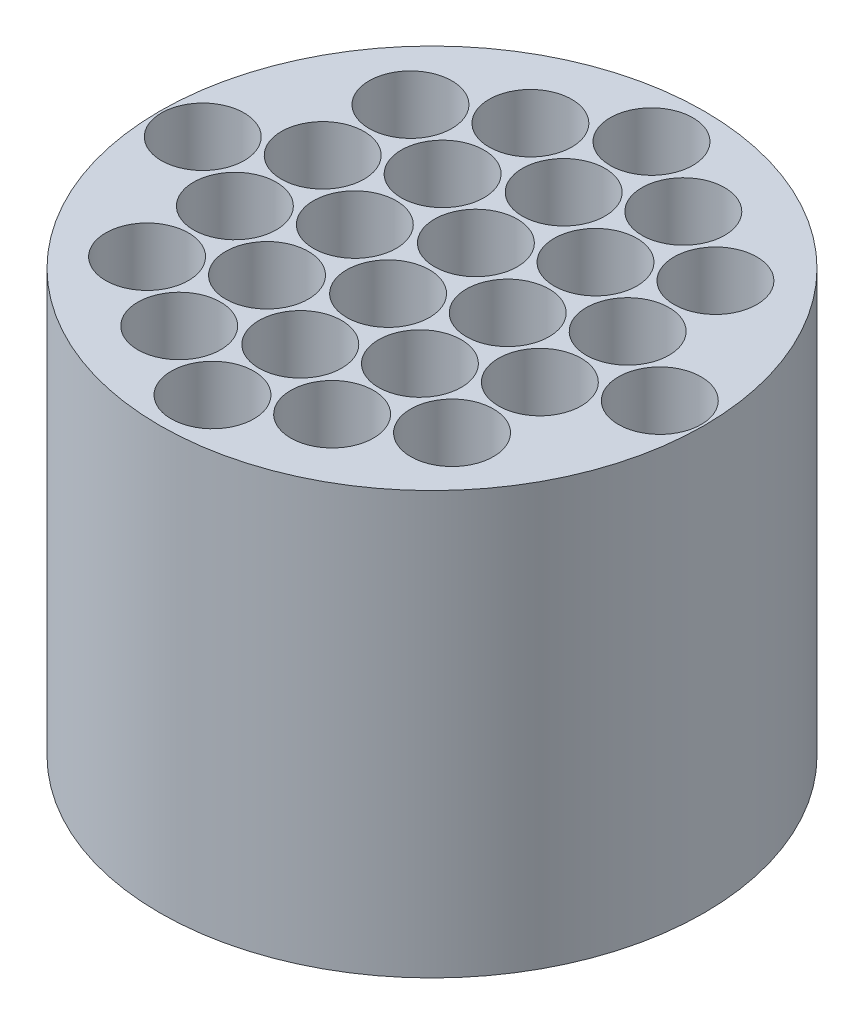
ISO-10303-21;
HEADER;
FILE_DESCRIPTION(('STEP AP214'),'2;1');
FILE_NAME('part.step','',(''),(''),'','','');
FILE_SCHEMA(('AUTOMOTIVE_DESIGN { 1 0 10303 214 1 1 1 1 }'));
ENDSEC;
DATA;
#1=APPLICATION_CONTEXT('core data for automotive mechanical design processes');
#2=APPLICATION_PROTOCOL_DEFINITION('international standard','automotive_design',2000,#1);
#3=PRODUCT_CONTEXT('',#1,'mechanical');
#4=PRODUCT('Part','Part','',(#3));
#5=PRODUCT_RELATED_PRODUCT_CATEGORY('part','',(#4));
#6=PRODUCT_DEFINITION_FORMATION('','',#4);
#7=PRODUCT_DEFINITION_CONTEXT('part definition',#1,'design');
#8=PRODUCT_DEFINITION('design','',#6,#7);
#9=PRODUCT_DEFINITION_SHAPE('','',#8);
#10=(LENGTH_UNIT() NAMED_UNIT(*) SI_UNIT(.MILLI.,.METRE.));
#11=(NAMED_UNIT(*) PLANE_ANGLE_UNIT() SI_UNIT($,.RADIAN.));
#12=(NAMED_UNIT(*) SI_UNIT($,.STERADIAN.) SOLID_ANGLE_UNIT());
#13=UNCERTAINTY_MEASURE_WITH_UNIT(LENGTH_MEASURE(1.E-05),#10,'distance_accuracy_value','');
#14=(GEOMETRIC_REPRESENTATION_CONTEXT(3) GLOBAL_UNCERTAINTY_ASSIGNED_CONTEXT((#13)) GLOBAL_UNIT_ASSIGNED_CONTEXT((#10,
#11,#12)) REPRESENTATION_CONTEXT('',''));
#15=CARTESIAN_POINT('',(0.,0.,0.));
#16=DIRECTION('',(0.,0.,1.));
#17=DIRECTION('',(1.,0.,0.));
#18=AXIS2_PLACEMENT_3D('',#15,#16,#17);
#19=CARTESIAN_POINT('',(0.,25.,0.));
#20=DIRECTION('',(0.,-1.,0.));
#21=DIRECTION('',(0.,0.,-1.));
#22=AXIS2_PLACEMENT_3D('',#19,#20,#21);
#23=CYLINDRICAL_SURFACE('',#22,16.125);
#24=CARTESIAN_POINT('',(0.,25.,0.));
#25=DIRECTION('',(0.,1.,0.));
#26=DIRECTION('',(0.,0.,1.));
#27=AXIS2_PLACEMENT_3D('',#24,#25,#26);
#28=CIRCLE('',#27,16.125);
#29=CARTESIAN_POINT('',(0.,25.,16.125));
#30=VERTEX_POINT('',#29);
#31=EDGE_CURVE('E10',#30,#30,#28,.T.);
#32=ORIENTED_EDGE('',*,*,#31,.F.);
#33=EDGE_LOOP('',(#32));
#34=FACE_BOUND('',#33,.T.);
#35=CARTESIAN_POINT('',(0.,0.,0.));
#36=DIRECTION('',(0.,1.,0.));
#37=DIRECTION('',(0.,0.,1.));
#38=AXIS2_PLACEMENT_3D('',#35,#36,#37);
#39=CIRCLE('',#38,16.125);
#40=CARTESIAN_POINT('',(0.,0.,16.125));
#41=VERTEX_POINT('',#40);
#42=EDGE_CURVE('E34',#41,#41,#39,.T.);
#43=ORIENTED_EDGE('',*,*,#42,.T.);
#44=EDGE_LOOP('',(#43));
#45=FACE_BOUND('',#44,.T.);
#46=ADVANCED_FACE('F31',(#34,#45),#23,.T.);
#47=CARTESIAN_POINT('',(0.,25.,0.));
#48=DIRECTION('',(0.,1.,0.));
#49=DIRECTION('',(0.,0.,1.));
#50=AXIS2_PLACEMENT_3D('',#47,#48,#49);
#51=PLANE('',#50);
#52=CARTESIAN_POINT('',(-13.5346825530837,25.,0.0432345065836004));
#53=DIRECTION('',(0.,-1.,0.));
#54=DIRECTION('',(0.,0.,1.));
#55=AXIS2_PLACEMENT_3D('',#52,#53,#54);
#56=CIRCLE('',#55,2.45);
#57=CARTESIAN_POINT('',(-13.5346825530837,25.,2.4932345065836));
#58=VERTEX_POINT('',#57);
#59=EDGE_CURVE('E193',#58,#58,#56,.T.);
#60=ORIENTED_EDGE('',*,*,#59,.T.);
#61=EDGE_LOOP('',(#60));
#62=FACE_BOUND('',#61,.T.);
#63=CARTESIAN_POINT('',(-9.03135045340461,25.,-7.7567654934164));
#64=DIRECTION('',(0.,-1.,0.));
#65=DIRECTION('',(0.,0.,1.));
#66=AXIS2_PLACEMENT_3D('',#63,#64,#65);
#67=CIRCLE('',#66,2.45000000000001);
#68=CARTESIAN_POINT('',(-9.03135045340461,25.,-5.30676549341639));
#69=VERTEX_POINT('',#68);
#70=EDGE_CURVE('E188',#69,#69,#67,.T.);
#71=ORIENTED_EDGE('',*,*,#70,.T.);
#72=EDGE_LOOP('',(#71));
#73=FACE_BOUND('',#72,.T.);
#74=CARTESIAN_POINT('',(-9.03135045340461,25.,-2.5567654934164));
#75=DIRECTION('',(0.,-1.,0.));
#76=DIRECTION('',(0.,0.,1.));
#77=AXIS2_PLACEMENT_3D('',#74,#75,#76);
#78=CIRCLE('',#77,2.45);
#79=CARTESIAN_POINT('',(-9.03135045340461,25.,-0.106765493416397));
#80=VERTEX_POINT('',#79);
#81=EDGE_CURVE('E182',#80,#80,#78,.T.);
#82=ORIENTED_EDGE('',*,*,#81,.T.);
#83=EDGE_LOOP('',(#82));
#84=FACE_BOUND('',#83,.T.);
#85=CARTESIAN_POINT('',(-9.03135045340461,25.,2.6432345065836));
#86=DIRECTION('',(0.,-1.,0.));
#87=DIRECTION('',(0.,0.,1.));
#88=AXIS2_PLACEMENT_3D('',#85,#86,#87);
#89=CIRCLE('',#88,2.45);
#90=CARTESIAN_POINT('',(-9.03135045340461,25.,5.0932345065836));
#91=VERTEX_POINT('',#90);
#92=EDGE_CURVE('E176',#91,#91,#89,.T.);
#93=ORIENTED_EDGE('',*,*,#92,.T.);
#94=EDGE_LOOP('',(#93));
#95=FACE_BOUND('',#94,.T.);
#96=CARTESIAN_POINT('',(-9.03135045340461,25.,7.8432345065836));
#97=DIRECTION('',(0.,-1.,0.));
#98=DIRECTION('',(0.,0.,1.));
#99=AXIS2_PLACEMENT_3D('',#96,#97,#98);
#100=CIRCLE('',#99,2.45000000000001);
#101=CARTESIAN_POINT('',(-9.03135045340461,25.,10.2932345065836));
#102=VERTEX_POINT('',#101);
#103=EDGE_CURVE('E169',#102,#102,#100,.T.);
#104=ORIENTED_EDGE('',*,*,#103,.T.);
#105=EDGE_LOOP('',(#104));
#106=FACE_BOUND('',#105,.T.);
#107=CARTESIAN_POINT('',(-4.52801835372553,25.,-5.1567654934164));
#108=DIRECTION('',(0.,-1.,0.));
#109=DIRECTION('',(0.,0.,1.));
#110=AXIS2_PLACEMENT_3D('',#107,#108,#109);
#111=CIRCLE('',#110,2.45);
#112=CARTESIAN_POINT('',(-4.52801835372553,25.,-2.7067654934164));
#113=VERTEX_POINT('',#112);
#114=EDGE_CURVE('E152',#113,#113,#111,.T.);
#115=ORIENTED_EDGE('',*,*,#114,.T.);
#116=EDGE_LOOP('',(#115));
#117=FACE_BOUND('',#116,.T.);
#118=CARTESIAN_POINT('',(-4.52801835372553,25.,5.2432345065836));
#119=DIRECTION('',(0.,-1.,0.));
#120=DIRECTION('',(0.,0.,1.));
#121=AXIS2_PLACEMENT_3D('',#118,#119,#120);
#122=CIRCLE('',#121,2.45);
#123=CARTESIAN_POINT('',(-4.52801835372553,25.,7.6932345065836));
#124=VERTEX_POINT('',#123);
#125=EDGE_CURVE('E145',#124,#124,#122,.T.);
#126=ORIENTED_EDGE('',*,*,#125,.T.);
#127=EDGE_LOOP('',(#126));
#128=FACE_BOUND('',#127,.T.);
#129=CARTESIAN_POINT('',(-4.52801835372553,25.,10.4432345065836));
#130=DIRECTION('',(0.,-1.,0.));
#131=DIRECTION('',(0.,0.,1.));
#132=AXIS2_PLACEMENT_3D('',#129,#130,#131);
#133=CIRCLE('',#132,2.45);
#134=CARTESIAN_POINT('',(-4.52801835372553,25.,12.8932345065836));
#135=VERTEX_POINT('',#134);
#136=EDGE_CURVE('E164',#135,#135,#133,.T.);
#137=ORIENTED_EDGE('',*,*,#136,.T.);
#138=EDGE_LOOP('',(#137));
#139=FACE_BOUND('',#138,.T.);
#140=CARTESIAN_POINT('',(-4.52801835372553,25.,-10.3567654934164));
#141=DIRECTION('',(0.,-1.,0.));
#142=DIRECTION('',(0.,0.,1.));
#143=AXIS2_PLACEMENT_3D('',#140,#141,#142);
#144=CIRCLE('',#143,2.45);
#145=CARTESIAN_POINT('',(-4.52801835372553,25.,-7.9067654934164));
#146=VERTEX_POINT('',#145);
#147=EDGE_CURVE('E157',#146,#146,#144,.T.);
#148=ORIENTED_EDGE('',*,*,#147,.T.);
#149=EDGE_LOOP('',(#148));
#150=FACE_BOUND('',#149,.T.);
#151=CARTESIAN_POINT('',(-4.52801835372553,25.,0.0432345065836028));
#152=DIRECTION('',(0.,-1.,0.));
#153=DIRECTION('',(0.,0.,1.));
#154=AXIS2_PLACEMENT_3D('',#151,#152,#153);
#155=CIRCLE('',#154,2.45);
#156=CARTESIAN_POINT('',(-4.52801835372553,25.,2.4932345065836));
#157=VERTEX_POINT('',#156);
#158=EDGE_CURVE('E139',#157,#157,#155,.T.);
#159=ORIENTED_EDGE('',*,*,#158,.T.);
#160=EDGE_LOOP('',(#159));
#161=FACE_BOUND('',#160,.T.);
#162=CARTESIAN_POINT('',(13.5346825530837,25.,0.0432345065836004));
#163=DIRECTION('',(0.,1.,0.));
#164=DIRECTION('',(0.,0.,1.));
#165=AXIS2_PLACEMENT_3D('',#162,#163,#164);
#166=CIRCLE('',#165,2.45);
#167=CARTESIAN_POINT('',(13.5346825530837,25.,2.4932345065836));
#168=VERTEX_POINT('',#167);
#169=EDGE_CURVE('E133',#168,#168,#166,.T.);
#170=ORIENTED_EDGE('',*,*,#169,.F.);
#171=EDGE_LOOP('',(#170));
#172=FACE_BOUND('',#171,.T.);
#173=CARTESIAN_POINT('',(9.03135045340461,25.,-7.7567654934164));
#174=DIRECTION('',(0.,1.,0.));
#175=DIRECTION('',(0.,0.,1.));
#176=AXIS2_PLACEMENT_3D('',#173,#174,#175);
#177=CIRCLE('',#176,2.45000000000001);
#178=CARTESIAN_POINT('',(9.03135045340461,25.,-5.30676549341639));
#179=VERTEX_POINT('',#178);
#180=EDGE_CURVE('E128',#179,#179,#177,.T.);
#181=ORIENTED_EDGE('',*,*,#180,.F.);
#182=EDGE_LOOP('',(#181));
#183=FACE_BOUND('',#182,.T.);
#184=CARTESIAN_POINT('',(9.03135045340461,25.,-2.5567654934164));
#185=DIRECTION('',(0.,1.,0.));
#186=DIRECTION('',(0.,0.,1.));
#187=AXIS2_PLACEMENT_3D('',#184,#185,#186);
#188=CIRCLE('',#187,2.45);
#189=CARTESIAN_POINT('',(9.03135045340461,25.,-0.106765493416397));
#190=VERTEX_POINT('',#189);
#191=EDGE_CURVE('E122',#190,#190,#188,.T.);
#192=ORIENTED_EDGE('',*,*,#191,.F.);
#193=EDGE_LOOP('',(#192));
#194=FACE_BOUND('',#193,.T.);
#195=CARTESIAN_POINT('',(9.03135045340461,25.,2.6432345065836));
#196=DIRECTION('',(0.,1.,0.));
#197=DIRECTION('',(0.,0.,1.));
#198=AXIS2_PLACEMENT_3D('',#195,#196,#197);
#199=CIRCLE('',#198,2.45);
#200=CARTESIAN_POINT('',(9.03135045340461,25.,5.0932345065836));
#201=VERTEX_POINT('',#200);
#202=EDGE_CURVE('E116',#201,#201,#199,.T.);
#203=ORIENTED_EDGE('',*,*,#202,.F.);
#204=EDGE_LOOP('',(#203));
#205=FACE_BOUND('',#204,.T.);
#206=CARTESIAN_POINT('',(9.03135045340461,25.,7.8432345065836));
#207=DIRECTION('',(0.,1.,0.));
#208=DIRECTION('',(0.,0.,1.));
#209=AXIS2_PLACEMENT_3D('',#206,#207,#208);
#210=CIRCLE('',#209,2.45000000000001);
#211=CARTESIAN_POINT('',(9.03135045340461,25.,10.2932345065836));
#212=VERTEX_POINT('',#211);
#213=EDGE_CURVE('E109',#212,#212,#210,.T.);
#214=ORIENTED_EDGE('',*,*,#213,.F.);
#215=EDGE_LOOP('',(#214));
#216=FACE_BOUND('',#215,.T.);
#217=CARTESIAN_POINT('',(4.52801835372553,25.,-5.1567654934164));
#218=DIRECTION('',(0.,1.,0.));
#219=DIRECTION('',(0.,0.,1.));
#220=AXIS2_PLACEMENT_3D('',#217,#218,#219);
#221=CIRCLE('',#220,2.45);
#222=CARTESIAN_POINT('',(4.52801835372553,25.,-2.7067654934164));
#223=VERTEX_POINT('',#222);
#224=EDGE_CURVE('E92',#223,#223,#221,.T.);
#225=ORIENTED_EDGE('',*,*,#224,.F.);
#226=EDGE_LOOP('',(#225));
#227=FACE_BOUND('',#226,.T.);
#228=CARTESIAN_POINT('',(4.52801835372553,25.,5.2432345065836));
#229=DIRECTION('',(0.,1.,0.));
#230=DIRECTION('',(0.,0.,1.));
#231=AXIS2_PLACEMENT_3D('',#228,#229,#230);
#232=CIRCLE('',#231,2.45);
#233=CARTESIAN_POINT('',(4.52801835372553,25.,7.6932345065836));
#234=VERTEX_POINT('',#233);
#235=EDGE_CURVE('E85',#234,#234,#232,.T.);
#236=ORIENTED_EDGE('',*,*,#235,.F.);
#237=EDGE_LOOP('',(#236));
#238=FACE_BOUND('',#237,.T.);
#239=CARTESIAN_POINT('',(4.52801835372553,25.,10.4432345065836));
#240=DIRECTION('',(0.,1.,0.));
#241=DIRECTION('',(0.,0.,1.));
#242=AXIS2_PLACEMENT_3D('',#239,#240,#241);
#243=CIRCLE('',#242,2.45);
#244=CARTESIAN_POINT('',(4.52801835372553,25.,12.8932345065836));
#245=VERTEX_POINT('',#244);
#246=EDGE_CURVE('E104',#245,#245,#243,.T.);
#247=ORIENTED_EDGE('',*,*,#246,.F.);
#248=EDGE_LOOP('',(#247));
#249=FACE_BOUND('',#248,.T.);
#250=CARTESIAN_POINT('',(4.52801835372553,25.,-10.3567654934164));
#251=DIRECTION('',(0.,1.,0.));
#252=DIRECTION('',(0.,0.,1.));
#253=AXIS2_PLACEMENT_3D('',#250,#251,#252);
#254=CIRCLE('',#253,2.45);
#255=CARTESIAN_POINT('',(4.52801835372553,25.,-7.9067654934164));
#256=VERTEX_POINT('',#255);
#257=EDGE_CURVE('E97',#256,#256,#254,.T.);
#258=ORIENTED_EDGE('',*,*,#257,.F.);
#259=EDGE_LOOP('',(#258));
#260=FACE_BOUND('',#259,.T.);
#261=CARTESIAN_POINT('',(4.52801835372553,25.,0.0432345065836028));
#262=DIRECTION('',(0.,1.,0.));
#263=DIRECTION('',(0.,0.,1.));
#264=AXIS2_PLACEMENT_3D('',#261,#262,#263);
#265=CIRCLE('',#264,2.45);
#266=CARTESIAN_POINT('',(4.52801835372553,25.,2.4932345065836));
#267=VERTEX_POINT('',#266);
#268=EDGE_CURVE('E79',#267,#267,#265,.T.);
#269=ORIENTED_EDGE('',*,*,#268,.F.);
#270=EDGE_LOOP('',(#269));
#271=FACE_BOUND('',#270,.T.);
#272=CARTESIAN_POINT('',(0.,25.,13.));
#273=DIRECTION('',(0.,1.,0.));
#274=DIRECTION('',(0.,0.,1.));
#275=AXIS2_PLACEMENT_3D('',#272,#273,#274);
#276=CIRCLE('',#275,2.45);
#277=CARTESIAN_POINT('',(0.,25.,15.45));
#278=VERTEX_POINT('',#277);
#279=EDGE_CURVE('E49',#278,#278,#276,.T.);
#280=ORIENTED_EDGE('',*,*,#279,.F.);
#281=EDGE_LOOP('',(#280));
#282=FACE_BOUND('',#281,.T.);
#283=CARTESIAN_POINT('',(0.,25.,-2.6));
#284=DIRECTION('',(0.,1.,0.));
#285=DIRECTION('',(0.,0.,1.));
#286=AXIS2_PLACEMENT_3D('',#283,#284,#285);
#287=CIRCLE('',#286,2.45);
#288=CARTESIAN_POINT('',(0.,25.,-0.149999999999998));
#289=VERTEX_POINT('',#288);
#290=EDGE_CURVE('E64',#289,#289,#287,.T.);
#291=ORIENTED_EDGE('',*,*,#290,.F.);
#292=EDGE_LOOP('',(#291));
#293=FACE_BOUND('',#292,.T.);
#294=CARTESIAN_POINT('',(0.,25.,-7.8));
#295=DIRECTION('',(0.,1.,0.));
#296=DIRECTION('',(0.,0.,1.));
#297=AXIS2_PLACEMENT_3D('',#294,#295,#296);
#298=CIRCLE('',#297,2.45);
#299=CARTESIAN_POINT('',(0.,25.,-5.35));
#300=VERTEX_POINT('',#299);
#301=EDGE_CURVE('E57',#300,#300,#298,.T.);
#302=ORIENTED_EDGE('',*,*,#301,.F.);
#303=EDGE_LOOP('',(#302));
#304=FACE_BOUND('',#303,.T.);
#305=CARTESIAN_POINT('',(0.,25.,-13.));
#306=DIRECTION('',(0.,1.,0.));
#307=DIRECTION('',(0.,0.,1.));
#308=AXIS2_PLACEMENT_3D('',#305,#306,#307);
#309=CIRCLE('',#308,2.45);
#310=CARTESIAN_POINT('',(0.,25.,-10.55));
#311=VERTEX_POINT('',#310);
#312=EDGE_CURVE('E74',#311,#311,#309,.T.);
#313=ORIENTED_EDGE('',*,*,#312,.F.);
#314=EDGE_LOOP('',(#313));
#315=FACE_BOUND('',#314,.T.);
#316=CARTESIAN_POINT('',(0.,25.,7.8));
#317=DIRECTION('',(0.,1.,0.));
#318=DIRECTION('',(0.,0.,1.));
#319=AXIS2_PLACEMENT_3D('',#316,#317,#318);
#320=CIRCLE('',#319,2.45);
#321=CARTESIAN_POINT('',(0.,25.,10.25));
#322=VERTEX_POINT('',#321);
#323=EDGE_CURVE('E56',#322,#322,#320,.T.);
#324=ORIENTED_EDGE('',*,*,#323,.F.);
#325=EDGE_LOOP('',(#324));
#326=FACE_BOUND('',#325,.T.);
#327=CARTESIAN_POINT('',(0.,25.,2.6));
#328=DIRECTION('',(0.,1.,0.));
#329=DIRECTION('',(0.,0.,1.));
#330=AXIS2_PLACEMENT_3D('',#327,#328,#329);
#331=CIRCLE('',#330,2.45);
#332=CARTESIAN_POINT('',(0.,25.,5.05));
#333=VERTEX_POINT('',#332);
#334=EDGE_CURVE('E43',#333,#333,#331,.T.);
#335=ORIENTED_EDGE('',*,*,#334,.F.);
#336=EDGE_LOOP('',(#335));
#337=FACE_BOUND('',#336,.T.);
#338=ORIENTED_EDGE('',*,*,#31,.T.);
#339=EDGE_LOOP('',(#338));
#340=FACE_BOUND('',#339,.T.);
#341=ADVANCED_FACE('F211',(#62,#73,#84,#95,#106,#117,#128,#139,#150,#161,#172,#183,#194,#205,
#216,#227,#238,#249,#260,#271,#282,#293,#304,#315,#326,#337,#340),#51,.T.);
#342=CARTESIAN_POINT('',(0.,0.,0.));
#343=DIRECTION('',(0.,1.,0.));
#344=DIRECTION('',(0.,0.,1.));
#345=AXIS2_PLACEMENT_3D('',#342,#343,#344);
#346=PLANE('',#345);
#347=ORIENTED_EDGE('',*,*,#42,.F.);
#348=EDGE_LOOP('',(#347));
#349=FACE_BOUND('',#348,.T.);
#350=ADVANCED_FACE('F216',(#349),#346,.F.);
#351=CARTESIAN_POINT('',(0.,6.25,2.6));
#352=DIRECTION('',(0.,1.,0.));
#353=DIRECTION('',(0.,0.,1.));
#354=AXIS2_PLACEMENT_3D('',#351,#352,#353);
#355=CYLINDRICAL_SURFACE('',#354,2.45);
#356=CARTESIAN_POINT('',(0.,6.25,2.6));
#357=DIRECTION('',(0.,1.,0.));
#358=DIRECTION('',(0.,0.,1.));
#359=AXIS2_PLACEMENT_3D('',#356,#357,#358);
#360=CIRCLE('',#359,2.45);
#361=CARTESIAN_POINT('',(0.,6.25,5.05));
#362=VERTEX_POINT('',#361);
#363=EDGE_CURVE('E41',#362,#362,#360,.T.);
#364=ORIENTED_EDGE('',*,*,#363,.F.);
#365=EDGE_LOOP('',(#364));
#366=FACE_BOUND('',#365,.T.);
#367=ORIENTED_EDGE('',*,*,#334,.T.);
#368=EDGE_LOOP('',(#367));
#369=FACE_BOUND('',#368,.T.);
#370=ADVANCED_FACE('F223',(#366,#369),#355,.F.);
#371=CARTESIAN_POINT('',(0.,6.25,2.6));
#372=DIRECTION('',(0.,1.,0.));
#373=DIRECTION('',(0.,0.,1.));
#374=AXIS2_PLACEMENT_3D('',#371,#372,#373);
#375=PLANE('',#374);
#376=ORIENTED_EDGE('',*,*,#363,.T.);
#377=EDGE_LOOP('',(#376));
#378=FACE_BOUND('',#377,.T.);
#379=ADVANCED_FACE('F227',(#378),#375,.T.);
#380=CARTESIAN_POINT('',(0.,6.25,7.8));
#381=DIRECTION('',(0.,1.,0.));
#382=DIRECTION('',(0.,0.,1.));
#383=AXIS2_PLACEMENT_3D('',#380,#381,#382);
#384=CYLINDRICAL_SURFACE('',#383,2.45);
#385=CARTESIAN_POINT('',(0.,6.25,7.8));
#386=DIRECTION('',(0.,1.,0.));
#387=DIRECTION('',(0.,0.,1.));
#388=AXIS2_PLACEMENT_3D('',#385,#386,#387);
#389=CIRCLE('',#388,2.45);
#390=CARTESIAN_POINT('',(0.,6.25,10.25));
#391=VERTEX_POINT('',#390);
#392=EDGE_CURVE('E71',#391,#391,#389,.T.);
#393=ORIENTED_EDGE('',*,*,#392,.F.);
#394=EDGE_LOOP('',(#393));
#395=FACE_BOUND('',#394,.T.);
#396=ORIENTED_EDGE('',*,*,#323,.T.);
#397=EDGE_LOOP('',(#396));
#398=FACE_BOUND('',#397,.T.);
#399=ADVANCED_FACE('F233',(#395,#398),#384,.F.);
#400=CARTESIAN_POINT('',(0.,6.25,7.8));
#401=DIRECTION('',(0.,1.,0.));
#402=DIRECTION('',(0.,0.,1.));
#403=AXIS2_PLACEMENT_3D('',#400,#401,#402);
#404=PLANE('',#403);
#405=ORIENTED_EDGE('',*,*,#392,.T.);
#406=EDGE_LOOP('',(#405));
#407=FACE_BOUND('',#406,.T.);
#408=ADVANCED_FACE('F263',(#407),#404,.T.);
#409=CARTESIAN_POINT('',(0.,6.25,-13.));
#410=DIRECTION('',(0.,1.,0.));
#411=DIRECTION('',(0.,0.,1.));
#412=AXIS2_PLACEMENT_3D('',#409,#410,#411);
#413=CYLINDRICAL_SURFACE('',#412,2.45);
#414=CARTESIAN_POINT('',(0.,6.25,-13.));
#415=DIRECTION('',(0.,1.,0.));
#416=DIRECTION('',(0.,0.,1.));
#417=AXIS2_PLACEMENT_3D('',#414,#415,#416);
#418=CIRCLE('',#417,2.45);
#419=CARTESIAN_POINT('',(0.,6.25,-10.55));
#420=VERTEX_POINT('',#419);
#421=EDGE_CURVE('E61',#420,#420,#418,.T.);
#422=ORIENTED_EDGE('',*,*,#421,.F.);
#423=EDGE_LOOP('',(#422));
#424=FACE_BOUND('',#423,.T.);
#425=ORIENTED_EDGE('',*,*,#312,.T.);
#426=EDGE_LOOP('',(#425));
#427=FACE_BOUND('',#426,.T.);
#428=ADVANCED_FACE('F267',(#424,#427),#413,.F.);
#429=CARTESIAN_POINT('',(0.,6.25,-13.));
#430=DIRECTION('',(0.,1.,0.));
#431=DIRECTION('',(0.,0.,1.));
#432=AXIS2_PLACEMENT_3D('',#429,#430,#431);
#433=PLANE('',#432);
#434=ORIENTED_EDGE('',*,*,#421,.T.);
#435=EDGE_LOOP('',(#434));
#436=FACE_BOUND('',#435,.T.);
#437=ADVANCED_FACE('F249',(#436),#433,.T.);
#438=CARTESIAN_POINT('',(0.,6.25,-7.8));
#439=DIRECTION('',(0.,1.,0.));
#440=DIRECTION('',(0.,0.,1.));
#441=AXIS2_PLACEMENT_3D('',#438,#439,#440);
#442=CYLINDRICAL_SURFACE('',#441,2.45);
#443=CARTESIAN_POINT('',(0.,6.25,-7.8));
#444=DIRECTION('',(0.,1.,0.));
#445=DIRECTION('',(0.,0.,1.));
#446=AXIS2_PLACEMENT_3D('',#443,#444,#445);
#447=CIRCLE('',#446,2.45);
#448=CARTESIAN_POINT('',(0.,6.25,-5.35));
#449=VERTEX_POINT('',#448);
#450=EDGE_CURVE('E60',#449,#449,#447,.T.);
#451=ORIENTED_EDGE('',*,*,#450,.F.);
#452=EDGE_LOOP('',(#451));
#453=FACE_BOUND('',#452,.T.);
#454=ORIENTED_EDGE('',*,*,#301,.T.);
#455=EDGE_LOOP('',(#454));
#456=FACE_BOUND('',#455,.T.);
#457=ADVANCED_FACE('F245',(#453,#456),#442,.F.);
#458=CARTESIAN_POINT('',(0.,6.25,-7.8));
#459=DIRECTION('',(0.,1.,0.));
#460=DIRECTION('',(0.,0.,1.));
#461=AXIS2_PLACEMENT_3D('',#458,#459,#460);
#462=PLANE('',#461);
#463=ORIENTED_EDGE('',*,*,#450,.T.);
#464=EDGE_LOOP('',(#463));
#465=FACE_BOUND('',#464,.T.);
#466=ADVANCED_FACE('F248',(#465),#462,.T.);
#467=CARTESIAN_POINT('',(0.,6.25,-2.6));
#468=DIRECTION('',(0.,1.,0.));
#469=DIRECTION('',(0.,0.,1.));
#470=AXIS2_PLACEMENT_3D('',#467,#468,#469);
#471=CYLINDRICAL_SURFACE('',#470,2.45);
#472=CARTESIAN_POINT('',(0.,6.25,-2.6));
#473=DIRECTION('',(0.,1.,0.));
#474=DIRECTION('',(0.,0.,1.));
#475=AXIS2_PLACEMENT_3D('',#472,#473,#474);
#476=CIRCLE('',#475,2.45);
#477=CARTESIAN_POINT('',(0.,6.25,-0.149999999999998));
#478=VERTEX_POINT('',#477);
#479=EDGE_CURVE('E46',#478,#478,#476,.T.);
#480=ORIENTED_EDGE('',*,*,#479,.F.);
#481=EDGE_LOOP('',(#480));
#482=FACE_BOUND('',#481,.T.);
#483=ORIENTED_EDGE('',*,*,#290,.T.);
#484=EDGE_LOOP('',(#483));
#485=FACE_BOUND('',#484,.T.);
#486=ADVANCED_FACE('F253',(#482,#485),#471,.F.);
#487=CARTESIAN_POINT('',(0.,6.25,-2.6));
#488=DIRECTION('',(0.,1.,0.));
#489=DIRECTION('',(0.,0.,1.));
#490=AXIS2_PLACEMENT_3D('',#487,#488,#489);
#491=PLANE('',#490);
#492=ORIENTED_EDGE('',*,*,#479,.T.);
#493=EDGE_LOOP('',(#492));
#494=FACE_BOUND('',#493,.T.);
#495=ADVANCED_FACE('F239',(#494),#491,.T.);
#496=CARTESIAN_POINT('',(0.,6.25,13.));
#497=DIRECTION('',(0.,1.,0.));
#498=DIRECTION('',(0.,0.,1.));
#499=AXIS2_PLACEMENT_3D('',#496,#497,#498);
#500=CYLINDRICAL_SURFACE('',#499,2.45);
#501=CARTESIAN_POINT('',(0.,6.25,13.));
#502=DIRECTION('',(0.,1.,0.));
#503=DIRECTION('',(0.,0.,1.));
#504=AXIS2_PLACEMENT_3D('',#501,#502,#503);
#505=CIRCLE('',#504,2.45);
#506=CARTESIAN_POINT('',(0.,6.25,15.45));
#507=VERTEX_POINT('',#506);
#508=EDGE_CURVE('E52',#507,#507,#505,.T.);
#509=ORIENTED_EDGE('',*,*,#508,.F.);
#510=EDGE_LOOP('',(#509));
#511=FACE_BOUND('',#510,.T.);
#512=ORIENTED_EDGE('',*,*,#279,.T.);
#513=EDGE_LOOP('',(#512));
#514=FACE_BOUND('',#513,.T.);
#515=ADVANCED_FACE('F235',(#511,#514),#500,.F.);
#516=CARTESIAN_POINT('',(0.,6.25,13.));
#517=DIRECTION('',(0.,1.,0.));
#518=DIRECTION('',(0.,0.,1.));
#519=AXIS2_PLACEMENT_3D('',#516,#517,#518);
#520=PLANE('',#519);
#521=ORIENTED_EDGE('',*,*,#508,.T.);
#522=EDGE_LOOP('',(#521));
#523=FACE_BOUND('',#522,.T.);
#524=ADVANCED_FACE('F238',(#523),#520,.T.);
#525=CARTESIAN_POINT('',(4.52801835372553,6.25,0.0432345065836028));
#526=DIRECTION('',(0.,1.,0.));
#527=DIRECTION('',(0.,0.,1.));
#528=AXIS2_PLACEMENT_3D('',#525,#526,#527);
#529=CYLINDRICAL_SURFACE('',#528,2.45);
#530=CARTESIAN_POINT('',(4.52801835372553,6.25,0.0432345065836028));
#531=DIRECTION('',(0.,1.,0.));
#532=DIRECTION('',(0.,0.,1.));
#533=AXIS2_PLACEMENT_3D('',#530,#531,#532);
#534=CIRCLE('',#533,2.45);
#535=CARTESIAN_POINT('',(4.52801835372553,6.25,2.4932345065836));
#536=VERTEX_POINT('',#535);
#537=EDGE_CURVE('E53',#536,#536,#534,.T.);
#538=ORIENTED_EDGE('',*,*,#537,.F.);
#539=EDGE_LOOP('',(#538));
#540=FACE_BOUND('',#539,.T.);
#541=ORIENTED_EDGE('',*,*,#268,.T.);
#542=EDGE_LOOP('',(#541));
#543=FACE_BOUND('',#542,.T.);
#544=ADVANCED_FACE('F243',(#540,#543),#529,.F.);
#545=CARTESIAN_POINT('',(4.52801835372553,6.25,0.0432345065836028));
#546=DIRECTION('',(0.,1.,0.));
#547=DIRECTION('',(0.,0.,1.));
#548=AXIS2_PLACEMENT_3D('',#545,#546,#547);
#549=PLANE('',#548);
#550=ORIENTED_EDGE('',*,*,#537,.T.);
#551=EDGE_LOOP('',(#550));
#552=FACE_BOUND('',#551,.T.);
#553=ADVANCED_FACE('F277',(#552),#549,.T.);
#554=CARTESIAN_POINT('',(4.52801835372553,6.25,-10.3567654934164));
#555=DIRECTION('',(0.,1.,0.));
#556=DIRECTION('',(0.,0.,1.));
#557=AXIS2_PLACEMENT_3D('',#554,#555,#556);
#558=CYLINDRICAL_SURFACE('',#557,2.45);
#559=CARTESIAN_POINT('',(4.52801835372553,6.25,-10.3567654934164));
#560=DIRECTION('',(0.,1.,0.));
#561=DIRECTION('',(0.,0.,1.));
#562=AXIS2_PLACEMENT_3D('',#559,#560,#561);
#563=CIRCLE('',#562,2.45);
#564=CARTESIAN_POINT('',(4.52801835372553,6.25,-7.9067654934164));
#565=VERTEX_POINT('',#564);
#566=EDGE_CURVE('E100',#565,#565,#563,.T.);
#567=ORIENTED_EDGE('',*,*,#566,.F.);
#568=EDGE_LOOP('',(#567));
#569=FACE_BOUND('',#568,.T.);
#570=ORIENTED_EDGE('',*,*,#257,.T.);
#571=EDGE_LOOP('',(#570));
#572=FACE_BOUND('',#571,.T.);
#573=ADVANCED_FACE('F281',(#569,#572),#558,.F.);
#574=CARTESIAN_POINT('',(4.52801835372553,6.25,-10.3567654934164));
#575=DIRECTION('',(0.,1.,0.));
#576=DIRECTION('',(0.,0.,1.));
#577=AXIS2_PLACEMENT_3D('',#574,#575,#576);
#578=PLANE('',#577);
#579=ORIENTED_EDGE('',*,*,#566,.T.);
#580=EDGE_LOOP('',(#579));
#581=FACE_BOUND('',#580,.T.);
#582=ADVANCED_FACE('F303',(#581),#578,.T.);
#583=CARTESIAN_POINT('',(4.52801835372553,6.25,10.4432345065836));
#584=DIRECTION('',(0.,1.,0.));
#585=DIRECTION('',(0.,0.,1.));
#586=AXIS2_PLACEMENT_3D('',#583,#584,#585);
#587=CYLINDRICAL_SURFACE('',#586,2.45);
#588=CARTESIAN_POINT('',(4.52801835372553,6.25,10.4432345065836));
#589=DIRECTION('',(0.,1.,0.));
#590=DIRECTION('',(0.,0.,1.));
#591=AXIS2_PLACEMENT_3D('',#588,#589,#590);
#592=CIRCLE('',#591,2.45);
#593=CARTESIAN_POINT('',(4.52801835372553,6.25,12.8932345065836));
#594=VERTEX_POINT('',#593);
#595=EDGE_CURVE('E89',#594,#594,#592,.T.);
#596=ORIENTED_EDGE('',*,*,#595,.F.);
#597=EDGE_LOOP('',(#596));
#598=FACE_BOUND('',#597,.T.);
#599=ORIENTED_EDGE('',*,*,#246,.T.);
#600=EDGE_LOOP('',(#599));
#601=FACE_BOUND('',#600,.T.);
#602=ADVANCED_FACE('F307',(#598,#601),#587,.F.);
#603=CARTESIAN_POINT('',(4.52801835372553,6.25,10.4432345065836));
#604=DIRECTION('',(0.,1.,0.));
#605=DIRECTION('',(0.,0.,1.));
#606=AXIS2_PLACEMENT_3D('',#603,#604,#605);
#607=PLANE('',#606);
#608=ORIENTED_EDGE('',*,*,#595,.T.);
#609=EDGE_LOOP('',(#608));
#610=FACE_BOUND('',#609,.T.);
#611=ADVANCED_FACE('F287',(#610),#607,.T.);
#612=CARTESIAN_POINT('',(4.52801835372553,6.25,5.2432345065836));
#613=DIRECTION('',(0.,1.,0.));
#614=DIRECTION('',(0.,0.,1.));
#615=AXIS2_PLACEMENT_3D('',#612,#613,#614);
#616=CYLINDRICAL_SURFACE('',#615,2.45);
#617=CARTESIAN_POINT('',(4.52801835372553,6.25,5.2432345065836));
#618=DIRECTION('',(0.,1.,0.));
#619=DIRECTION('',(0.,0.,1.));
#620=AXIS2_PLACEMENT_3D('',#617,#618,#619);
#621=CIRCLE('',#620,2.45);
#622=CARTESIAN_POINT('',(4.52801835372553,6.25,7.6932345065836));
#623=VERTEX_POINT('',#622);
#624=EDGE_CURVE('E88',#623,#623,#621,.T.);
#625=ORIENTED_EDGE('',*,*,#624,.F.);
#626=EDGE_LOOP('',(#625));
#627=FACE_BOUND('',#626,.T.);
#628=ORIENTED_EDGE('',*,*,#235,.T.);
#629=EDGE_LOOP('',(#628));
#630=FACE_BOUND('',#629,.T.);
#631=ADVANCED_FACE('F283',(#627,#630),#616,.F.);
#632=CARTESIAN_POINT('',(4.52801835372553,6.25,5.2432345065836));
#633=DIRECTION('',(0.,1.,0.));
#634=DIRECTION('',(0.,0.,1.));
#635=AXIS2_PLACEMENT_3D('',#632,#633,#634);
#636=PLANE('',#635);
#637=ORIENTED_EDGE('',*,*,#624,.T.);
#638=EDGE_LOOP('',(#637));
#639=FACE_BOUND('',#638,.T.);
#640=ADVANCED_FACE('F286',(#639),#636,.T.);
#641=CARTESIAN_POINT('',(4.52801835372553,6.25,-5.1567654934164));
#642=DIRECTION('',(0.,1.,0.));
#643=DIRECTION('',(0.,0.,1.));
#644=AXIS2_PLACEMENT_3D('',#641,#642,#643);
#645=CYLINDRICAL_SURFACE('',#644,2.45);
#646=CARTESIAN_POINT('',(4.52801835372553,6.25,-5.1567654934164));
#647=DIRECTION('',(0.,1.,0.));
#648=DIRECTION('',(0.,0.,1.));
#649=AXIS2_PLACEMENT_3D('',#646,#647,#648);
#650=CIRCLE('',#649,2.45);
#651=CARTESIAN_POINT('',(4.52801835372553,6.25,-2.7067654934164));
#652=VERTEX_POINT('',#651);
#653=EDGE_CURVE('E82',#652,#652,#650,.T.);
#654=ORIENTED_EDGE('',*,*,#653,.F.);
#655=EDGE_LOOP('',(#654));
#656=FACE_BOUND('',#655,.T.);
#657=ORIENTED_EDGE('',*,*,#224,.T.);
#658=EDGE_LOOP('',(#657));
#659=FACE_BOUND('',#658,.T.);
#660=ADVANCED_FACE('F291',(#656,#659),#645,.F.);
#661=CARTESIAN_POINT('',(4.52801835372553,6.25,-5.1567654934164));
#662=DIRECTION('',(0.,1.,0.));
#663=DIRECTION('',(0.,0.,1.));
#664=AXIS2_PLACEMENT_3D('',#661,#662,#663);
#665=PLANE('',#664);
#666=ORIENTED_EDGE('',*,*,#653,.T.);
#667=EDGE_LOOP('',(#666));
#668=FACE_BOUND('',#667,.T.);
#669=ADVANCED_FACE('F295',(#668),#665,.T.);
#670=CARTESIAN_POINT('',(9.03135045340461,6.25,7.8432345065836));
#671=DIRECTION('',(0.,1.,0.));
#672=DIRECTION('',(0.,0.,1.));
#673=AXIS2_PLACEMENT_3D('',#670,#671,#672);
#674=CYLINDRICAL_SURFACE('',#673,2.45000000000001);
#675=CARTESIAN_POINT('',(9.03135045340461,6.25,7.8432345065836));
#676=DIRECTION('',(0.,1.,0.));
#677=DIRECTION('',(0.,0.,1.));
#678=AXIS2_PLACEMENT_3D('',#675,#676,#677);
#679=CIRCLE('',#678,2.45000000000001);
#680=CARTESIAN_POINT('',(9.03135045340461,6.25,10.2932345065836));
#681=VERTEX_POINT('',#680);
#682=EDGE_CURVE('E112',#681,#681,#679,.T.);
#683=ORIENTED_EDGE('',*,*,#682,.F.);
#684=EDGE_LOOP('',(#683));
#685=FACE_BOUND('',#684,.T.);
#686=ORIENTED_EDGE('',*,*,#213,.T.);
#687=EDGE_LOOP('',(#686));
#688=FACE_BOUND('',#687,.T.);
#689=ADVANCED_FACE('F299',(#685,#688),#674,.F.);
#690=CARTESIAN_POINT('',(9.03135045340461,6.25,7.8432345065836));
#691=DIRECTION('',(0.,1.,0.));
#692=DIRECTION('',(0.,0.,1.));
#693=AXIS2_PLACEMENT_3D('',#690,#691,#692);
#694=PLANE('',#693);
#695=ORIENTED_EDGE('',*,*,#682,.T.);
#696=EDGE_LOOP('',(#695));
#697=FACE_BOUND('',#696,.T.);
#698=ADVANCED_FACE('F317',(#697),#694,.T.);
#699=CARTESIAN_POINT('',(9.03135045340461,6.25,2.6432345065836));
#700=DIRECTION('',(0.,1.,0.));
#701=DIRECTION('',(0.,0.,1.));
#702=AXIS2_PLACEMENT_3D('',#699,#700,#701);
#703=CYLINDRICAL_SURFACE('',#702,2.45);
#704=CARTESIAN_POINT('',(9.03135045340461,6.25,2.6432345065836));
#705=DIRECTION('',(0.,1.,0.));
#706=DIRECTION('',(0.,0.,1.));
#707=AXIS2_PLACEMENT_3D('',#704,#705,#706);
#708=CIRCLE('',#707,2.45);
#709=CARTESIAN_POINT('',(9.03135045340461,6.25,5.0932345065836));
#710=VERTEX_POINT('',#709);
#711=EDGE_CURVE('E119',#710,#710,#708,.T.);
#712=ORIENTED_EDGE('',*,*,#711,.F.);
#713=EDGE_LOOP('',(#712));
#714=FACE_BOUND('',#713,.T.);
#715=ORIENTED_EDGE('',*,*,#202,.T.);
#716=EDGE_LOOP('',(#715));
#717=FACE_BOUND('',#716,.T.);
#718=ADVANCED_FACE('F321',(#714,#717),#703,.F.);
#719=CARTESIAN_POINT('',(9.03135045340461,6.25,2.6432345065836));
#720=DIRECTION('',(0.,1.,0.));
#721=DIRECTION('',(0.,0.,1.));
#722=AXIS2_PLACEMENT_3D('',#719,#720,#721);
#723=PLANE('',#722);
#724=ORIENTED_EDGE('',*,*,#711,.T.);
#725=EDGE_LOOP('',(#724));
#726=FACE_BOUND('',#725,.T.);
#727=ADVANCED_FACE('F325',(#726),#723,.T.);
#728=CARTESIAN_POINT('',(9.03135045340461,6.25,-2.5567654934164));
#729=DIRECTION('',(0.,1.,0.));
#730=DIRECTION('',(0.,0.,1.));
#731=AXIS2_PLACEMENT_3D('',#728,#729,#730);
#732=CYLINDRICAL_SURFACE('',#731,2.45);
#733=CARTESIAN_POINT('',(9.03135045340461,6.25,-2.5567654934164));
#734=DIRECTION('',(0.,1.,0.));
#735=DIRECTION('',(0.,0.,1.));
#736=AXIS2_PLACEMENT_3D('',#733,#734,#735);
#737=CIRCLE('',#736,2.45);
#738=CARTESIAN_POINT('',(9.03135045340461,6.25,-0.106765493416397));
#739=VERTEX_POINT('',#738);
#740=EDGE_CURVE('E125',#739,#739,#737,.T.);
#741=ORIENTED_EDGE('',*,*,#740,.F.);
#742=EDGE_LOOP('',(#741));
#743=FACE_BOUND('',#742,.T.);
#744=ORIENTED_EDGE('',*,*,#191,.T.);
#745=EDGE_LOOP('',(#744));
#746=FACE_BOUND('',#745,.T.);
#747=ADVANCED_FACE('F329',(#743,#746),#732,.F.);
#748=CARTESIAN_POINT('',(9.03135045340461,6.25,-2.5567654934164));
#749=DIRECTION('',(0.,1.,0.));
#750=DIRECTION('',(0.,0.,1.));
#751=AXIS2_PLACEMENT_3D('',#748,#749,#750);
#752=PLANE('',#751);
#753=ORIENTED_EDGE('',*,*,#740,.T.);
#754=EDGE_LOOP('',(#753));
#755=FACE_BOUND('',#754,.T.);
#756=ADVANCED_FACE('F333',(#755),#752,.T.);
#757=CARTESIAN_POINT('',(9.03135045340461,6.25,-7.7567654934164));
#758=DIRECTION('',(0.,1.,0.));
#759=DIRECTION('',(0.,0.,1.));
#760=AXIS2_PLACEMENT_3D('',#757,#758,#759);
#761=CYLINDRICAL_SURFACE('',#760,2.45000000000001);
#762=CARTESIAN_POINT('',(9.03135045340461,6.25,-7.7567654934164));
#763=DIRECTION('',(0.,1.,0.));
#764=DIRECTION('',(0.,0.,1.));
#765=AXIS2_PLACEMENT_3D('',#762,#763,#764);
#766=CIRCLE('',#765,2.45000000000001);
#767=CARTESIAN_POINT('',(9.03135045340461,6.25,-5.30676549341639));
#768=VERTEX_POINT('',#767);
#769=EDGE_CURVE('E101',#768,#768,#766,.T.);
#770=ORIENTED_EDGE('',*,*,#769,.F.);
#771=EDGE_LOOP('',(#770));
#772=FACE_BOUND('',#771,.T.);
#773=ORIENTED_EDGE('',*,*,#180,.T.);
#774=EDGE_LOOP('',(#773));
#775=FACE_BOUND('',#774,.T.);
#776=ADVANCED_FACE('F337',(#772,#775),#761,.F.);
#777=CARTESIAN_POINT('',(9.03135045340461,6.25,-7.7567654934164));
#778=DIRECTION('',(0.,1.,0.));
#779=DIRECTION('',(0.,0.,1.));
#780=AXIS2_PLACEMENT_3D('',#777,#778,#779);
#781=PLANE('',#780);
#782=ORIENTED_EDGE('',*,*,#769,.T.);
#783=EDGE_LOOP('',(#782));
#784=FACE_BOUND('',#783,.T.);
#785=ADVANCED_FACE('F341',(#784),#781,.T.);
#786=CARTESIAN_POINT('',(13.5346825530837,6.25,0.0432345065836004));
#787=DIRECTION('',(0.,1.,0.));
#788=DIRECTION('',(0.,0.,1.));
#789=AXIS2_PLACEMENT_3D('',#786,#787,#788);
#790=CYLINDRICAL_SURFACE('',#789,2.45);
#791=CARTESIAN_POINT('',(13.5346825530837,6.25,0.0432345065836004));
#792=DIRECTION('',(0.,1.,0.));
#793=DIRECTION('',(0.,0.,1.));
#794=AXIS2_PLACEMENT_3D('',#791,#792,#793);
#795=CIRCLE('',#794,2.45);
#796=CARTESIAN_POINT('',(13.5346825530837,6.25,2.4932345065836));
#797=VERTEX_POINT('',#796);
#798=EDGE_CURVE('E113',#797,#797,#795,.T.);
#799=ORIENTED_EDGE('',*,*,#798,.F.);
#800=EDGE_LOOP('',(#799));
#801=FACE_BOUND('',#800,.T.);
#802=ORIENTED_EDGE('',*,*,#169,.T.);
#803=EDGE_LOOP('',(#802));
#804=FACE_BOUND('',#803,.T.);
#805=ADVANCED_FACE('F345',(#801,#804),#790,.F.);
#806=CARTESIAN_POINT('',(13.5346825530837,6.25,0.0432345065836004));
#807=DIRECTION('',(0.,1.,0.));
#808=DIRECTION('',(0.,0.,1.));
#809=AXIS2_PLACEMENT_3D('',#806,#807,#808);
#810=PLANE('',#809);
#811=ORIENTED_EDGE('',*,*,#798,.T.);
#812=EDGE_LOOP('',(#811));
#813=FACE_BOUND('',#812,.T.);
#814=ADVANCED_FACE('F349',(#813),#810,.T.);
#815=CARTESIAN_POINT('',(-4.52801835372553,6.25,0.0432345065836028));
#816=DIRECTION('',(0.,1.,0.));
#817=DIRECTION('',(0.,0.,1.));
#818=AXIS2_PLACEMENT_3D('',#815,#816,#817);
#819=CYLINDRICAL_SURFACE('',#818,2.45);
#820=CARTESIAN_POINT('',(-4.52801835372553,6.25,0.0432345065836028));
#821=DIRECTION('',(0.,-1.,0.));
#822=DIRECTION('',(0.,0.,1.));
#823=AXIS2_PLACEMENT_3D('',#820,#821,#822);
#824=CIRCLE('',#823,2.45);
#825=CARTESIAN_POINT('',(-4.52801835372553,6.25,2.4932345065836));
#826=VERTEX_POINT('',#825);
#827=EDGE_CURVE('E136',#826,#826,#824,.T.);
#828=ORIENTED_EDGE('',*,*,#827,.T.);
#829=EDGE_LOOP('',(#828));
#830=FACE_BOUND('',#829,.T.);
#831=ORIENTED_EDGE('',*,*,#158,.F.);
#832=EDGE_LOOP('',(#831));
#833=FACE_BOUND('',#832,.T.);
#834=ADVANCED_FACE('F353',(#830,#833),#819,.F.);
#835=CARTESIAN_POINT('',(-4.52801835372553,6.25,0.0432345065836028));
#836=DIRECTION('',(0.,1.,0.));
#837=DIRECTION('',(0.,0.,1.));
#838=AXIS2_PLACEMENT_3D('',#835,#836,#837);
#839=PLANE('',#838);
#840=ORIENTED_EDGE('',*,*,#827,.F.);
#841=EDGE_LOOP('',(#840));
#842=FACE_BOUND('',#841,.T.);
#843=ADVANCED_FACE('F357',(#842),#839,.T.);
#844=CARTESIAN_POINT('',(-4.52801835372553,6.25,-10.3567654934164));
#845=DIRECTION('',(0.,1.,0.));
#846=DIRECTION('',(0.,0.,1.));
#847=AXIS2_PLACEMENT_3D('',#844,#845,#846);
#848=CYLINDRICAL_SURFACE('',#847,2.45);
#849=CARTESIAN_POINT('',(-4.52801835372553,6.25,-10.3567654934164));
#850=DIRECTION('',(0.,-1.,0.));
#851=DIRECTION('',(0.,0.,1.));
#852=AXIS2_PLACEMENT_3D('',#849,#850,#851);
#853=CIRCLE('',#852,2.45);
#854=CARTESIAN_POINT('',(-4.52801835372553,6.25,-7.9067654934164));
#855=VERTEX_POINT('',#854);
#856=EDGE_CURVE('E160',#855,#855,#853,.T.);
#857=ORIENTED_EDGE('',*,*,#856,.T.);
#858=EDGE_LOOP('',(#857));
#859=FACE_BOUND('',#858,.T.);
#860=ORIENTED_EDGE('',*,*,#147,.F.);
#861=EDGE_LOOP('',(#860));
#862=FACE_BOUND('',#861,.T.);
#863=ADVANCED_FACE('F361',(#859,#862),#848,.F.);
#864=CARTESIAN_POINT('',(-4.52801835372553,6.25,-10.3567654934164));
#865=DIRECTION('',(0.,1.,0.));
#866=DIRECTION('',(0.,0.,1.));
#867=AXIS2_PLACEMENT_3D('',#864,#865,#866);
#868=PLANE('',#867);
#869=ORIENTED_EDGE('',*,*,#856,.F.);
#870=EDGE_LOOP('',(#869));
#871=FACE_BOUND('',#870,.T.);
#872=ADVANCED_FACE('F383',(#871),#868,.T.);
#873=CARTESIAN_POINT('',(-4.52801835372553,6.25,10.4432345065836));
#874=DIRECTION('',(0.,1.,0.));
#875=DIRECTION('',(0.,0.,1.));
#876=AXIS2_PLACEMENT_3D('',#873,#874,#875);
#877=CYLINDRICAL_SURFACE('',#876,2.45);
#878=CARTESIAN_POINT('',(-4.52801835372553,6.25,10.4432345065836));
#879=DIRECTION('',(0.,-1.,0.));
#880=DIRECTION('',(0.,0.,1.));
#881=AXIS2_PLACEMENT_3D('',#878,#879,#880);
#882=CIRCLE('',#881,2.45);
#883=CARTESIAN_POINT('',(-4.52801835372553,6.25,12.8932345065836));
#884=VERTEX_POINT('',#883);
#885=EDGE_CURVE('E149',#884,#884,#882,.T.);
#886=ORIENTED_EDGE('',*,*,#885,.T.);
#887=EDGE_LOOP('',(#886));
#888=FACE_BOUND('',#887,.T.);
#889=ORIENTED_EDGE('',*,*,#136,.F.);
#890=EDGE_LOOP('',(#889));
#891=FACE_BOUND('',#890,.T.);
#892=ADVANCED_FACE('F387',(#888,#891),#877,.F.);
#893=CARTESIAN_POINT('',(-4.52801835372553,6.25,10.4432345065836));
#894=DIRECTION('',(0.,1.,0.));
#895=DIRECTION('',(0.,0.,1.));
#896=AXIS2_PLACEMENT_3D('',#893,#894,#895);
#897=PLANE('',#896);
#898=ORIENTED_EDGE('',*,*,#885,.F.);
#899=EDGE_LOOP('',(#898));
#900=FACE_BOUND('',#899,.T.);
#901=ADVANCED_FACE('F367',(#900),#897,.T.);
#902=CARTESIAN_POINT('',(-4.52801835372553,6.25,5.2432345065836));
#903=DIRECTION('',(0.,1.,0.));
#904=DIRECTION('',(0.,0.,1.));
#905=AXIS2_PLACEMENT_3D('',#902,#903,#904);
#906=CYLINDRICAL_SURFACE('',#905,2.45);
#907=CARTESIAN_POINT('',(-4.52801835372553,6.25,5.2432345065836));
#908=DIRECTION('',(0.,-1.,0.));
#909=DIRECTION('',(0.,0.,1.));
#910=AXIS2_PLACEMENT_3D('',#907,#908,#909);
#911=CIRCLE('',#910,2.45);
#912=CARTESIAN_POINT('',(-4.52801835372553,6.25,7.6932345065836));
#913=VERTEX_POINT('',#912);
#914=EDGE_CURVE('E148',#913,#913,#911,.T.);
#915=ORIENTED_EDGE('',*,*,#914,.T.);
#916=EDGE_LOOP('',(#915));
#917=FACE_BOUND('',#916,.T.);
#918=ORIENTED_EDGE('',*,*,#125,.F.);
#919=EDGE_LOOP('',(#918));
#920=FACE_BOUND('',#919,.T.);
#921=ADVANCED_FACE('F363',(#917,#920),#906,.F.);
#922=CARTESIAN_POINT('',(-4.52801835372553,6.25,5.2432345065836));
#923=DIRECTION('',(0.,1.,0.));
#924=DIRECTION('',(0.,0.,1.));
#925=AXIS2_PLACEMENT_3D('',#922,#923,#924);
#926=PLANE('',#925);
#927=ORIENTED_EDGE('',*,*,#914,.F.);
#928=EDGE_LOOP('',(#927));
#929=FACE_BOUND('',#928,.T.);
#930=ADVANCED_FACE('F366',(#929),#926,.T.);
#931=CARTESIAN_POINT('',(-4.52801835372553,6.25,-5.1567654934164));
#932=DIRECTION('',(0.,1.,0.));
#933=DIRECTION('',(0.,0.,1.));
#934=AXIS2_PLACEMENT_3D('',#931,#932,#933);
#935=CYLINDRICAL_SURFACE('',#934,2.45);
#936=CARTESIAN_POINT('',(-4.52801835372553,6.25,-5.1567654934164));
#937=DIRECTION('',(0.,-1.,0.));
#938=DIRECTION('',(0.,0.,1.));
#939=AXIS2_PLACEMENT_3D('',#936,#937,#938);
#940=CIRCLE('',#939,2.45);
#941=CARTESIAN_POINT('',(-4.52801835372553,6.25,-2.7067654934164));
#942=VERTEX_POINT('',#941);
#943=EDGE_CURVE('E142',#942,#942,#940,.T.);
#944=ORIENTED_EDGE('',*,*,#943,.T.);
#945=EDGE_LOOP('',(#944));
#946=FACE_BOUND('',#945,.T.);
#947=ORIENTED_EDGE('',*,*,#114,.F.);
#948=EDGE_LOOP('',(#947));
#949=FACE_BOUND('',#948,.T.);
#950=ADVANCED_FACE('F371',(#946,#949),#935,.F.);
#951=CARTESIAN_POINT('',(-4.52801835372553,6.25,-5.1567654934164));
#952=DIRECTION('',(0.,1.,0.));
#953=DIRECTION('',(0.,0.,1.));
#954=AXIS2_PLACEMENT_3D('',#951,#952,#953);
#955=PLANE('',#954);
#956=ORIENTED_EDGE('',*,*,#943,.F.);
#957=EDGE_LOOP('',(#956));
#958=FACE_BOUND('',#957,.T.);
#959=ADVANCED_FACE('F375',(#958),#955,.T.);
#960=CARTESIAN_POINT('',(-9.03135045340461,6.25,7.8432345065836));
#961=DIRECTION('',(0.,1.,0.));
#962=DIRECTION('',(0.,0.,1.));
#963=AXIS2_PLACEMENT_3D('',#960,#961,#962);
#964=CYLINDRICAL_SURFACE('',#963,2.45000000000001);
#965=CARTESIAN_POINT('',(-9.03135045340461,6.25,7.8432345065836));
#966=DIRECTION('',(0.,-1.,0.));
#967=DIRECTION('',(0.,0.,1.));
#968=AXIS2_PLACEMENT_3D('',#965,#966,#967);
#969=CIRCLE('',#968,2.45000000000001);
#970=CARTESIAN_POINT('',(-9.03135045340461,6.25,10.2932345065836));
#971=VERTEX_POINT('',#970);
#972=EDGE_CURVE('E172',#971,#971,#969,.T.);
#973=ORIENTED_EDGE('',*,*,#972,.T.);
#974=EDGE_LOOP('',(#973));
#975=FACE_BOUND('',#974,.T.);
#976=ORIENTED_EDGE('',*,*,#103,.F.);
#977=EDGE_LOOP('',(#976));
#978=FACE_BOUND('',#977,.T.);
#979=ADVANCED_FACE('F379',(#975,#978),#964,.F.);
#980=CARTESIAN_POINT('',(-9.03135045340461,6.25,7.8432345065836));
#981=DIRECTION('',(0.,1.,0.));
#982=DIRECTION('',(0.,0.,1.));
#983=AXIS2_PLACEMENT_3D('',#980,#981,#982);
#984=PLANE('',#983);
#985=ORIENTED_EDGE('',*,*,#972,.F.);
#986=EDGE_LOOP('',(#985));
#987=FACE_BOUND('',#986,.T.);
#988=ADVANCED_FACE('F397',(#987),#984,.T.);
#989=CARTESIAN_POINT('',(-9.03135045340461,6.25,2.6432345065836));
#990=DIRECTION('',(0.,1.,0.));
#991=DIRECTION('',(0.,0.,1.));
#992=AXIS2_PLACEMENT_3D('',#989,#990,#991);
#993=CYLINDRICAL_SURFACE('',#992,2.45);
#994=CARTESIAN_POINT('',(-9.03135045340461,6.25,2.6432345065836));
#995=DIRECTION('',(0.,-1.,0.));
#996=DIRECTION('',(0.,0.,1.));
#997=AXIS2_PLACEMENT_3D('',#994,#995,#996);
#998=CIRCLE('',#997,2.45);
#999=CARTESIAN_POINT('',(-9.03135045340461,6.25,5.0932345065836));
#1000=VERTEX_POINT('',#999);
#1001=EDGE_CURVE('E179',#1000,#1000,#998,.T.);
#1002=ORIENTED_EDGE('',*,*,#1001,.T.);
#1003=EDGE_LOOP('',(#1002));
#1004=FACE_BOUND('',#1003,.T.);
#1005=ORIENTED_EDGE('',*,*,#92,.F.);
#1006=EDGE_LOOP('',(#1005));
#1007=FACE_BOUND('',#1006,.T.);
#1008=ADVANCED_FACE('F401',(#1004,#1007),#993,.F.);
#1009=CARTESIAN_POINT('',(-9.03135045340461,6.25,2.6432345065836));
#1010=DIRECTION('',(0.,1.,0.));
#1011=DIRECTION('',(0.,0.,1.));
#1012=AXIS2_PLACEMENT_3D('',#1009,#1010,#1011);
#1013=PLANE('',#1012);
#1014=ORIENTED_EDGE('',*,*,#1001,.F.);
#1015=EDGE_LOOP('',(#1014));
#1016=FACE_BOUND('',#1015,.T.);
#1017=ADVANCED_FACE('F405',(#1016),#1013,.T.);
#1018=CARTESIAN_POINT('',(-9.03135045340461,6.25,-2.5567654934164));
#1019=DIRECTION('',(0.,1.,0.));
#1020=DIRECTION('',(0.,0.,1.));
#1021=AXIS2_PLACEMENT_3D('',#1018,#1019,#1020);
#1022=CYLINDRICAL_SURFACE('',#1021,2.45);
#1023=CARTESIAN_POINT('',(-9.03135045340461,6.25,-2.5567654934164));
#1024=DIRECTION('',(0.,-1.,0.));
#1025=DIRECTION('',(0.,0.,1.));
#1026=AXIS2_PLACEMENT_3D('',#1023,#1024,#1025);
#1027=CIRCLE('',#1026,2.45);
#1028=CARTESIAN_POINT('',(-9.03135045340461,6.25,-0.106765493416397));
#1029=VERTEX_POINT('',#1028);
#1030=EDGE_CURVE('E185',#1029,#1029,#1027,.T.);
#1031=ORIENTED_EDGE('',*,*,#1030,.T.);
#1032=EDGE_LOOP('',(#1031));
#1033=FACE_BOUND('',#1032,.T.);
#1034=ORIENTED_EDGE('',*,*,#81,.F.);
#1035=EDGE_LOOP('',(#1034));
#1036=FACE_BOUND('',#1035,.T.);
#1037=ADVANCED_FACE('F409',(#1033,#1036),#1022,.F.);
#1038=CARTESIAN_POINT('',(-9.03135045340461,6.25,-2.5567654934164));
#1039=DIRECTION('',(0.,1.,0.));
#1040=DIRECTION('',(0.,0.,1.));
#1041=AXIS2_PLACEMENT_3D('',#1038,#1039,#1040);
#1042=PLANE('',#1041);
#1043=ORIENTED_EDGE('',*,*,#1030,.F.);
#1044=EDGE_LOOP('',(#1043));
#1045=FACE_BOUND('',#1044,.T.);
#1046=ADVANCED_FACE('F413',(#1045),#1042,.T.);
#1047=CARTESIAN_POINT('',(-9.03135045340461,6.25,-7.7567654934164));
#1048=DIRECTION('',(0.,1.,0.));
#1049=DIRECTION('',(0.,0.,1.));
#1050=AXIS2_PLACEMENT_3D('',#1047,#1048,#1049);
#1051=CYLINDRICAL_SURFACE('',#1050,2.45000000000001);
#1052=CARTESIAN_POINT('',(-9.03135045340461,6.25,-7.7567654934164));
#1053=DIRECTION('',(0.,-1.,0.));
#1054=DIRECTION('',(0.,0.,1.));
#1055=AXIS2_PLACEMENT_3D('',#1052,#1053,#1054);
#1056=CIRCLE('',#1055,2.45000000000001);
#1057=CARTESIAN_POINT('',(-9.03135045340461,6.25,-5.30676549341639));
#1058=VERTEX_POINT('',#1057);
#1059=EDGE_CURVE('E161',#1058,#1058,#1056,.T.);
#1060=ORIENTED_EDGE('',*,*,#1059,.T.);
#1061=EDGE_LOOP('',(#1060));
#1062=FACE_BOUND('',#1061,.T.);
#1063=ORIENTED_EDGE('',*,*,#70,.F.);
#1064=EDGE_LOOP('',(#1063));
#1065=FACE_BOUND('',#1064,.T.);
#1066=ADVANCED_FACE('F417',(#1062,#1065),#1051,.F.);
#1067=CARTESIAN_POINT('',(-9.03135045340461,6.25,-7.7567654934164));
#1068=DIRECTION('',(0.,1.,0.));
#1069=DIRECTION('',(0.,0.,1.));
#1070=AXIS2_PLACEMENT_3D('',#1067,#1068,#1069);
#1071=PLANE('',#1070);
#1072=ORIENTED_EDGE('',*,*,#1059,.F.);
#1073=EDGE_LOOP('',(#1072));
#1074=FACE_BOUND('',#1073,.T.);
#1075=ADVANCED_FACE('F208',(#1074),#1071,.T.);
#1076=CARTESIAN_POINT('',(-13.5346825530837,6.25,0.0432345065836004));
#1077=DIRECTION('',(0.,1.,0.));
#1078=DIRECTION('',(0.,0.,1.));
#1079=AXIS2_PLACEMENT_3D('',#1076,#1077,#1078);
#1080=CYLINDRICAL_SURFACE('',#1079,2.45);
#1081=CARTESIAN_POINT('',(-13.5346825530837,6.25,0.0432345065836004));
#1082=DIRECTION('',(0.,-1.,0.));
#1083=DIRECTION('',(0.,0.,1.));
#1084=AXIS2_PLACEMENT_3D('',#1081,#1082,#1083);
#1085=CIRCLE('',#1084,2.45);
#1086=CARTESIAN_POINT('',(-13.5346825530837,6.25,2.4932345065836));
#1087=VERTEX_POINT('',#1086);
#1088=EDGE_CURVE('E173',#1087,#1087,#1085,.T.);
#1089=ORIENTED_EDGE('',*,*,#1088,.T.);
#1090=EDGE_LOOP('',(#1089));
#1091=FACE_BOUND('',#1090,.T.);
#1092=ORIENTED_EDGE('',*,*,#59,.F.);
#1093=EDGE_LOOP('',(#1092));
#1094=FACE_BOUND('',#1093,.T.);
#1095=ADVANCED_FACE('F199',(#1091,#1094),#1080,.F.);
#1096=CARTESIAN_POINT('',(-13.5346825530837,6.25,0.0432345065836004));
#1097=DIRECTION('',(0.,1.,0.));
#1098=DIRECTION('',(0.,0.,1.));
#1099=AXIS2_PLACEMENT_3D('',#1096,#1097,#1098);
#1100=PLANE('',#1099);
#1101=ORIENTED_EDGE('',*,*,#1088,.F.);
#1102=EDGE_LOOP('',(#1101));
#1103=FACE_BOUND('',#1102,.T.);
#1104=ADVANCED_FACE('F202',(#1103),#1100,.T.);
#1105=CLOSED_SHELL('',(#46,#341,#350,#370,#379,#399,#408,#428,#437,#457,#466,#486,#495,#515,
#524,#544,#553,#573,#582,#602,#611,#631,#640,#660,#669,#689,#698,#718,#727,#747,#756,#776,#785,
#805,#814,#834,#843,#863,#872,#892,#901,#921,#930,#950,#959,#979,#988,#1008,#1017,#1037,#1046,
#1066,#1075,#1095,#1104));
#1106=MANIFOLD_SOLID_BREP('B2',#1105);
#1107=ADVANCED_BREP_SHAPE_REPRESENTATION('',(#18,#1106),#14);
#1108=SHAPE_DEFINITION_REPRESENTATION(#9,#1107);
ENDSEC;
END-ISO-10303-21;
